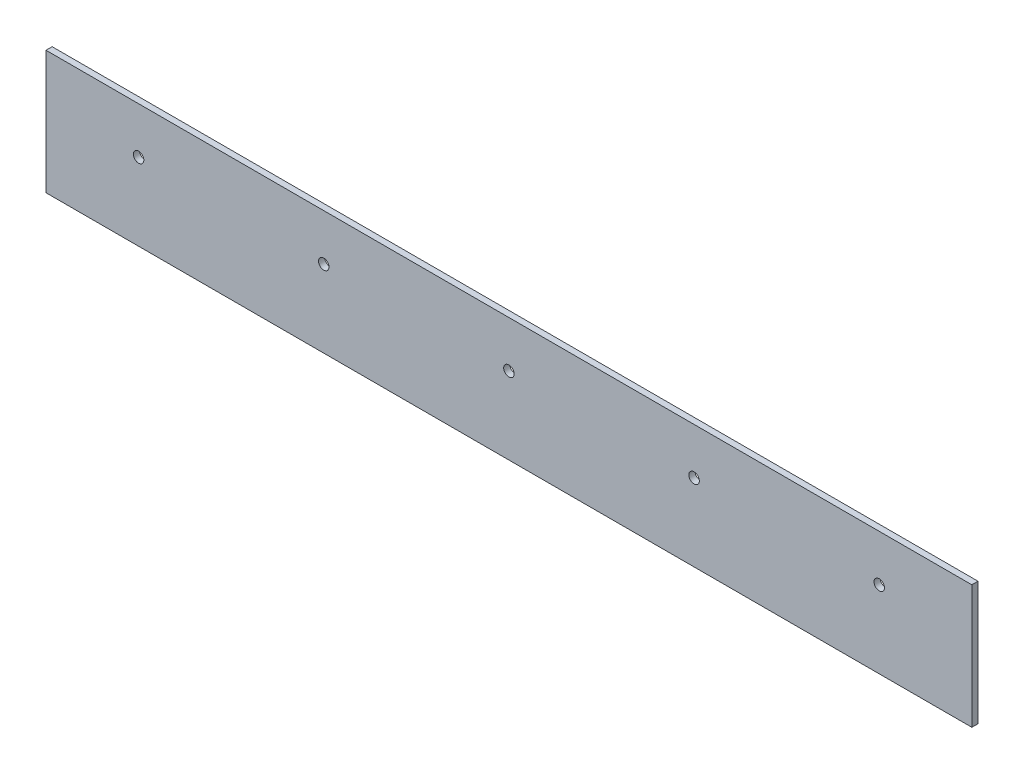
ISO-10303-21;
HEADER;
FILE_DESCRIPTION(('STEP AP214'),'2;1');
FILE_NAME('part.step','',(''),(''),'','','');
FILE_SCHEMA(('AUTOMOTIVE_DESIGN { 1 0 10303 214 1 1 1 1 }'));
ENDSEC;
DATA;
#1=APPLICATION_CONTEXT('core data for automotive mechanical design processes');
#2=APPLICATION_PROTOCOL_DEFINITION('international standard','automotive_design',2000,#1);
#3=PRODUCT_CONTEXT('',#1,'mechanical');
#4=PRODUCT('Part','Part','',(#3));
#5=PRODUCT_RELATED_PRODUCT_CATEGORY('part','',(#4));
#6=PRODUCT_DEFINITION_FORMATION('','',#4);
#7=PRODUCT_DEFINITION_CONTEXT('part definition',#1,'design');
#8=PRODUCT_DEFINITION('design','',#6,#7);
#9=PRODUCT_DEFINITION_SHAPE('','',#8);
#10=(LENGTH_UNIT() NAMED_UNIT(*) SI_UNIT(.MILLI.,.METRE.));
#11=(NAMED_UNIT(*) PLANE_ANGLE_UNIT() SI_UNIT($,.RADIAN.));
#12=(NAMED_UNIT(*) SI_UNIT($,.STERADIAN.) SOLID_ANGLE_UNIT());
#13=UNCERTAINTY_MEASURE_WITH_UNIT(LENGTH_MEASURE(1.E-05),#10,'distance_accuracy_value','');
#14=(GEOMETRIC_REPRESENTATION_CONTEXT(3) GLOBAL_UNCERTAINTY_ASSIGNED_CONTEXT((#13)) GLOBAL_UNIT_ASSIGNED_CONTEXT((#10,
#11,#12)) REPRESENTATION_CONTEXT('',''));
#15=CARTESIAN_POINT('',(0.,0.,0.));
#16=DIRECTION('',(0.,0.,1.));
#17=DIRECTION('',(1.,0.,0.));
#18=AXIS2_PLACEMENT_3D('',#15,#16,#17);
#19=CARTESIAN_POINT('',(0.,0.,10.));
#20=DIRECTION('',(0.,0.,-1.));
#21=DIRECTION('',(-1.,0.,0.));
#22=AXIS2_PLACEMENT_3D('',#19,#20,#21);
#23=PLANE('',#22);
#24=DIRECTION('',(0.,-1.,0.));
#25=VECTOR('',#24,1.);
#26=CARTESIAN_POINT('',(0.,0.,10.));
#27=LINE('',#26,#25);
#28=CARTESIAN_POINT('',(0.,200.,10.));
#29=VERTEX_POINT('',#28);
#30=CARTESIAN_POINT('',(0.,0.,10.));
#31=VERTEX_POINT('',#30);
#32=EDGE_CURVE('E85',#29,#31,#27,.T.);
#33=ORIENTED_EDGE('',*,*,#32,.T.);
#34=DIRECTION('',(1.,0.,0.));
#35=VECTOR('',#34,1.);
#36=CARTESIAN_POINT('',(0.,0.,10.));
#37=LINE('',#36,#35);
#38=CARTESIAN_POINT('',(1500.,0.,10.));
#39=VERTEX_POINT('',#38);
#40=EDGE_CURVE('E80',#31,#39,#37,.T.);
#41=ORIENTED_EDGE('',*,*,#40,.T.);
#42=DIRECTION('',(0.,1.,0.));
#43=VECTOR('',#42,1.);
#44=CARTESIAN_POINT('',(1500.,0.,10.));
#45=LINE('',#44,#43);
#46=CARTESIAN_POINT('',(1500.,200.,10.));
#47=VERTEX_POINT('',#46);
#48=EDGE_CURVE('E83',#39,#47,#45,.T.);
#49=ORIENTED_EDGE('',*,*,#48,.T.);
#50=DIRECTION('',(-1.,0.,0.));
#51=VECTOR('',#50,1.);
#52=CARTESIAN_POINT('',(0.,200.,10.));
#53=LINE('',#52,#51);
#54=EDGE_CURVE('E50',#47,#29,#53,.T.);
#55=ORIENTED_EDGE('',*,*,#54,.T.);
#56=EDGE_LOOP('',(#33,#41,#49,#55));
#57=FACE_BOUND('',#56,.T.);
#58=CARTESIAN_POINT('',(150.,125.,10.));
#59=DIRECTION('',(0.,0.,1.));
#60=DIRECTION('',(1.,0.,0.));
#61=AXIS2_PLACEMENT_3D('',#58,#59,#60);
#62=CIRCLE('',#61,8.50000000000001);
#63=CARTESIAN_POINT('',(158.5,125.,10.));
#64=VERTEX_POINT('',#63);
#65=EDGE_CURVE('E100',#64,#64,#62,.T.);
#66=ORIENTED_EDGE('',*,*,#65,.F.);
#67=EDGE_LOOP('',(#66));
#68=FACE_BOUND('',#67,.T.);
#69=CARTESIAN_POINT('',(450.,125.,10.));
#70=DIRECTION('',(0.,0.,1.));
#71=DIRECTION('',(1.,0.,0.));
#72=AXIS2_PLACEMENT_3D('',#69,#70,#71);
#73=CIRCLE('',#72,8.50000000000001);
#74=CARTESIAN_POINT('',(458.5,125.,10.));
#75=VERTEX_POINT('',#74);
#76=EDGE_CURVE('E115',#75,#75,#73,.T.);
#77=ORIENTED_EDGE('',*,*,#76,.F.);
#78=EDGE_LOOP('',(#77));
#79=FACE_BOUND('',#78,.T.);
#80=CARTESIAN_POINT('',(750.,125.,10.));
#81=DIRECTION('',(0.,0.,1.));
#82=DIRECTION('',(1.,0.,0.));
#83=AXIS2_PLACEMENT_3D('',#80,#81,#82);
#84=CIRCLE('',#83,8.50000000000001);
#85=CARTESIAN_POINT('',(758.5,125.,10.));
#86=VERTEX_POINT('',#85);
#87=EDGE_CURVE('E121',#86,#86,#84,.T.);
#88=ORIENTED_EDGE('',*,*,#87,.F.);
#89=EDGE_LOOP('',(#88));
#90=FACE_BOUND('',#89,.T.);
#91=CARTESIAN_POINT('',(1050.,125.,10.));
#92=DIRECTION('',(0.,0.,1.));
#93=DIRECTION('',(1.,0.,0.));
#94=AXIS2_PLACEMENT_3D('',#91,#92,#93);
#95=CIRCLE('',#94,8.5);
#96=CARTESIAN_POINT('',(1058.5,125.,10.));
#97=VERTEX_POINT('',#96);
#98=EDGE_CURVE('E127',#97,#97,#95,.T.);
#99=ORIENTED_EDGE('',*,*,#98,.F.);
#100=EDGE_LOOP('',(#99));
#101=FACE_BOUND('',#100,.T.);
#102=CARTESIAN_POINT('',(1350.,125.,10.));
#103=DIRECTION('',(0.,0.,1.));
#104=DIRECTION('',(1.,0.,0.));
#105=AXIS2_PLACEMENT_3D('',#102,#103,#104);
#106=CIRCLE('',#105,8.5);
#107=CARTESIAN_POINT('',(1358.5,125.,10.));
#108=VERTEX_POINT('',#107);
#109=EDGE_CURVE('E133',#108,#108,#106,.T.);
#110=ORIENTED_EDGE('',*,*,#109,.F.);
#111=EDGE_LOOP('',(#110));
#112=FACE_BOUND('',#111,.T.);
#113=ADVANCED_FACE('F33',(#57,#68,#79,#90,#101,#112),#23,.F.);
#114=CARTESIAN_POINT('',(0.,0.,0.));
#115=DIRECTION('',(0.,0.,-1.));
#116=DIRECTION('',(-1.,0.,0.));
#117=AXIS2_PLACEMENT_3D('',#114,#115,#116);
#118=PLANE('',#117);
#119=CARTESIAN_POINT('',(1050.,125.,0.));
#120=DIRECTION('',(0.,0.,1.));
#121=DIRECTION('',(1.,0.,0.));
#122=AXIS2_PLACEMENT_3D('',#119,#120,#121);
#123=CIRCLE('',#122,8.5);
#124=CARTESIAN_POINT('',(1058.5,125.,0.));
#125=VERTEX_POINT('',#124);
#126=EDGE_CURVE('E130',#125,#125,#123,.T.);
#127=ORIENTED_EDGE('',*,*,#126,.T.);
#128=EDGE_LOOP('',(#127));
#129=FACE_BOUND('',#128,.T.);
#130=CARTESIAN_POINT('',(450.,125.,0.));
#131=DIRECTION('',(0.,0.,1.));
#132=DIRECTION('',(1.,0.,0.));
#133=AXIS2_PLACEMENT_3D('',#130,#131,#132);
#134=CIRCLE('',#133,8.50000000000001);
#135=CARTESIAN_POINT('',(458.5,125.,0.));
#136=VERTEX_POINT('',#135);
#137=EDGE_CURVE('E118',#136,#136,#134,.T.);
#138=ORIENTED_EDGE('',*,*,#137,.T.);
#139=EDGE_LOOP('',(#138));
#140=FACE_BOUND('',#139,.T.);
#141=DIRECTION('',(0.,-1.,0.));
#142=VECTOR('',#141,1.);
#143=CARTESIAN_POINT('',(0.,0.,0.));
#144=LINE('',#143,#142);
#145=CARTESIAN_POINT('',(0.,200.,0.));
#146=VERTEX_POINT('',#145);
#147=CARTESIAN_POINT('',(0.,0.,0.));
#148=VERTEX_POINT('',#147);
#149=EDGE_CURVE('E97',#146,#148,#144,.T.);
#150=ORIENTED_EDGE('',*,*,#149,.F.);
#151=DIRECTION('',(-1.,0.,0.));
#152=VECTOR('',#151,1.);
#153=CARTESIAN_POINT('',(0.,200.,0.));
#154=LINE('',#153,#152);
#155=CARTESIAN_POINT('',(1500.,200.,0.));
#156=VERTEX_POINT('',#155);
#157=EDGE_CURVE('E73',#156,#146,#154,.T.);
#158=ORIENTED_EDGE('',*,*,#157,.F.);
#159=DIRECTION('',(0.,1.,0.));
#160=VECTOR('',#159,1.);
#161=CARTESIAN_POINT('',(1500.,0.,0.));
#162=LINE('',#161,#160);
#163=CARTESIAN_POINT('',(1500.,0.,0.));
#164=VERTEX_POINT('',#163);
#165=EDGE_CURVE('E67',#164,#156,#162,.T.);
#166=ORIENTED_EDGE('',*,*,#165,.F.);
#167=DIRECTION('',(1.,0.,0.));
#168=VECTOR('',#167,1.);
#169=CARTESIAN_POINT('',(0.,0.,0.));
#170=LINE('',#169,#168);
#171=EDGE_CURVE('E89',#148,#164,#170,.T.);
#172=ORIENTED_EDGE('',*,*,#171,.F.);
#173=EDGE_LOOP('',(#150,#158,#166,#172));
#174=FACE_BOUND('',#173,.T.);
#175=CARTESIAN_POINT('',(150.,125.,0.));
#176=DIRECTION('',(0.,0.,1.));
#177=DIRECTION('',(1.,0.,0.));
#178=AXIS2_PLACEMENT_3D('',#175,#176,#177);
#179=CIRCLE('',#178,8.50000000000001);
#180=CARTESIAN_POINT('',(158.5,125.,0.));
#181=VERTEX_POINT('',#180);
#182=EDGE_CURVE('E112',#181,#181,#179,.T.);
#183=ORIENTED_EDGE('',*,*,#182,.T.);
#184=EDGE_LOOP('',(#183));
#185=FACE_BOUND('',#184,.T.);
#186=CARTESIAN_POINT('',(750.,125.,0.));
#187=DIRECTION('',(0.,0.,1.));
#188=DIRECTION('',(1.,0.,0.));
#189=AXIS2_PLACEMENT_3D('',#186,#187,#188);
#190=CIRCLE('',#189,8.50000000000001);
#191=CARTESIAN_POINT('',(758.5,125.,0.));
#192=VERTEX_POINT('',#191);
#193=EDGE_CURVE('E124',#192,#192,#190,.T.);
#194=ORIENTED_EDGE('',*,*,#193,.T.);
#195=EDGE_LOOP('',(#194));
#196=FACE_BOUND('',#195,.T.);
#197=CARTESIAN_POINT('',(1350.,125.,0.));
#198=DIRECTION('',(0.,0.,1.));
#199=DIRECTION('',(1.,0.,0.));
#200=AXIS2_PLACEMENT_3D('',#197,#198,#199);
#201=CIRCLE('',#200,8.5);
#202=CARTESIAN_POINT('',(1358.5,125.,0.));
#203=VERTEX_POINT('',#202);
#204=EDGE_CURVE('E136',#203,#203,#201,.T.);
#205=ORIENTED_EDGE('',*,*,#204,.T.);
#206=EDGE_LOOP('',(#205));
#207=FACE_BOUND('',#206,.T.);
#208=ADVANCED_FACE('F108',(#129,#140,#174,#185,#196,#207),#118,.T.);
#209=CARTESIAN_POINT('',(0.,0.,10.));
#210=DIRECTION('',(1.,0.,0.));
#211=DIRECTION('',(0.,0.,-1.));
#212=AXIS2_PLACEMENT_3D('',#209,#210,#211);
#213=PLANE('',#212);
#214=ORIENTED_EDGE('',*,*,#149,.T.);
#215=DIRECTION('',(0.,0.,-1.));
#216=VECTOR('',#215,1.);
#217=CARTESIAN_POINT('',(0.,0.,10.));
#218=LINE('',#217,#216);
#219=EDGE_CURVE('E11',#31,#148,#218,.T.);
#220=ORIENTED_EDGE('',*,*,#219,.F.);
#221=ORIENTED_EDGE('',*,*,#32,.F.);
#222=DIRECTION('',(0.,0.,-1.));
#223=VECTOR('',#222,1.);
#224=CARTESIAN_POINT('',(0.,200.,10.));
#225=LINE('',#224,#223);
#226=EDGE_CURVE('E93',#29,#146,#225,.T.);
#227=ORIENTED_EDGE('',*,*,#226,.T.);
#228=EDGE_LOOP('',(#214,#220,#221,#227));
#229=FACE_BOUND('',#228,.T.);
#230=ADVANCED_FACE('F35',(#229),#213,.F.);
#231=CARTESIAN_POINT('',(0.,0.,10.));
#232=DIRECTION('',(0.,1.,0.));
#233=DIRECTION('',(0.,0.,1.));
#234=AXIS2_PLACEMENT_3D('',#231,#232,#233);
#235=PLANE('',#234);
#236=ORIENTED_EDGE('',*,*,#171,.T.);
#237=DIRECTION('',(0.,0.,-1.));
#238=VECTOR('',#237,1.);
#239=CARTESIAN_POINT('',(1500.,0.,10.));
#240=LINE('',#239,#238);
#241=EDGE_CURVE('E42',#39,#164,#240,.T.);
#242=ORIENTED_EDGE('',*,*,#241,.F.);
#243=ORIENTED_EDGE('',*,*,#40,.F.);
#244=ORIENTED_EDGE('',*,*,#219,.T.);
#245=EDGE_LOOP('',(#236,#242,#243,#244));
#246=FACE_BOUND('',#245,.T.);
#247=ADVANCED_FACE('F88',(#246),#235,.F.);
#248=CARTESIAN_POINT('',(1500.,0.,10.));
#249=DIRECTION('',(-1.,0.,0.));
#250=DIRECTION('',(0.,0.,1.));
#251=AXIS2_PLACEMENT_3D('',#248,#249,#250);
#252=PLANE('',#251);
#253=ORIENTED_EDGE('',*,*,#165,.T.);
#254=DIRECTION('',(0.,0.,-1.));
#255=VECTOR('',#254,1.);
#256=CARTESIAN_POINT('',(1500.,200.,10.));
#257=LINE('',#256,#255);
#258=EDGE_CURVE('E90',#47,#156,#257,.T.);
#259=ORIENTED_EDGE('',*,*,#258,.F.);
#260=ORIENTED_EDGE('',*,*,#48,.F.);
#261=ORIENTED_EDGE('',*,*,#241,.T.);
#262=EDGE_LOOP('',(#253,#259,#260,#261));
#263=FACE_BOUND('',#262,.T.);
#264=ADVANCED_FACE('F91',(#263),#252,.F.);
#265=CARTESIAN_POINT('',(0.,200.,10.));
#266=DIRECTION('',(0.,-1.,0.));
#267=DIRECTION('',(0.,0.,-1.));
#268=AXIS2_PLACEMENT_3D('',#265,#266,#267);
#269=PLANE('',#268);
#270=ORIENTED_EDGE('',*,*,#157,.T.);
#271=ORIENTED_EDGE('',*,*,#226,.F.);
#272=ORIENTED_EDGE('',*,*,#54,.F.);
#273=ORIENTED_EDGE('',*,*,#258,.T.);
#274=EDGE_LOOP('',(#270,#271,#272,#273));
#275=FACE_BOUND('',#274,.T.);
#276=ADVANCED_FACE('F105',(#275),#269,.F.);
#277=CARTESIAN_POINT('',(150.,125.,10.));
#278=DIRECTION('',(0.,0.,-1.));
#279=DIRECTION('',(-1.,0.,0.));
#280=AXIS2_PLACEMENT_3D('',#277,#278,#279);
#281=CYLINDRICAL_SURFACE('',#280,8.50000000000001);
#282=ORIENTED_EDGE('',*,*,#65,.T.);
#283=EDGE_LOOP('',(#282));
#284=FACE_BOUND('',#283,.T.);
#285=ORIENTED_EDGE('',*,*,#182,.F.);
#286=EDGE_LOOP('',(#285));
#287=FACE_BOUND('',#286,.T.);
#288=ADVANCED_FACE('F153',(#284,#287),#281,.F.);
#289=CARTESIAN_POINT('',(450.,125.,10.));
#290=DIRECTION('',(0.,0.,-1.));
#291=DIRECTION('',(-1.,0.,0.));
#292=AXIS2_PLACEMENT_3D('',#289,#290,#291);
#293=CYLINDRICAL_SURFACE('',#292,8.50000000000001);
#294=ORIENTED_EDGE('',*,*,#76,.T.);
#295=EDGE_LOOP('',(#294));
#296=FACE_BOUND('',#295,.T.);
#297=ORIENTED_EDGE('',*,*,#137,.F.);
#298=EDGE_LOOP('',(#297));
#299=FACE_BOUND('',#298,.T.);
#300=ADVANCED_FACE('F199',(#296,#299),#293,.F.);
#301=CARTESIAN_POINT('',(750.,125.,10.));
#302=DIRECTION('',(0.,0.,-1.));
#303=DIRECTION('',(-1.,0.,0.));
#304=AXIS2_PLACEMENT_3D('',#301,#302,#303);
#305=CYLINDRICAL_SURFACE('',#304,8.50000000000001);
#306=ORIENTED_EDGE('',*,*,#87,.T.);
#307=EDGE_LOOP('',(#306));
#308=FACE_BOUND('',#307,.T.);
#309=ORIENTED_EDGE('',*,*,#193,.F.);
#310=EDGE_LOOP('',(#309));
#311=FACE_BOUND('',#310,.T.);
#312=ADVANCED_FACE('F207',(#308,#311),#305,.F.);
#313=CARTESIAN_POINT('',(1050.,125.,10.));
#314=DIRECTION('',(0.,0.,-1.));
#315=DIRECTION('',(-1.,0.,0.));
#316=AXIS2_PLACEMENT_3D('',#313,#314,#315);
#317=CYLINDRICAL_SURFACE('',#316,8.5);
#318=ORIENTED_EDGE('',*,*,#98,.T.);
#319=EDGE_LOOP('',(#318));
#320=FACE_BOUND('',#319,.T.);
#321=ORIENTED_EDGE('',*,*,#126,.F.);
#322=EDGE_LOOP('',(#321));
#323=FACE_BOUND('',#322,.T.);
#324=ADVANCED_FACE('F215',(#320,#323),#317,.F.);
#325=CARTESIAN_POINT('',(1350.,125.,10.));
#326=DIRECTION('',(0.,0.,-1.));
#327=DIRECTION('',(-1.,0.,0.));
#328=AXIS2_PLACEMENT_3D('',#325,#326,#327);
#329=CYLINDRICAL_SURFACE('',#328,8.5);
#330=ORIENTED_EDGE('',*,*,#109,.T.);
#331=EDGE_LOOP('',(#330));
#332=FACE_BOUND('',#331,.T.);
#333=ORIENTED_EDGE('',*,*,#204,.F.);
#334=EDGE_LOOP('',(#333));
#335=FACE_BOUND('',#334,.T.);
#336=ADVANCED_FACE('F142',(#332,#335),#329,.F.);
#337=CLOSED_SHELL('',(#113,#208,#230,#247,#264,#276,#288,#300,#312,#324,#336));
#338=MANIFOLD_SOLID_BREP('B2',#337);
#339=ADVANCED_BREP_SHAPE_REPRESENTATION('',(#18,#338),#14);
#340=SHAPE_DEFINITION_REPRESENTATION(#9,#339);
ENDSEC;
END-ISO-10303-21;
